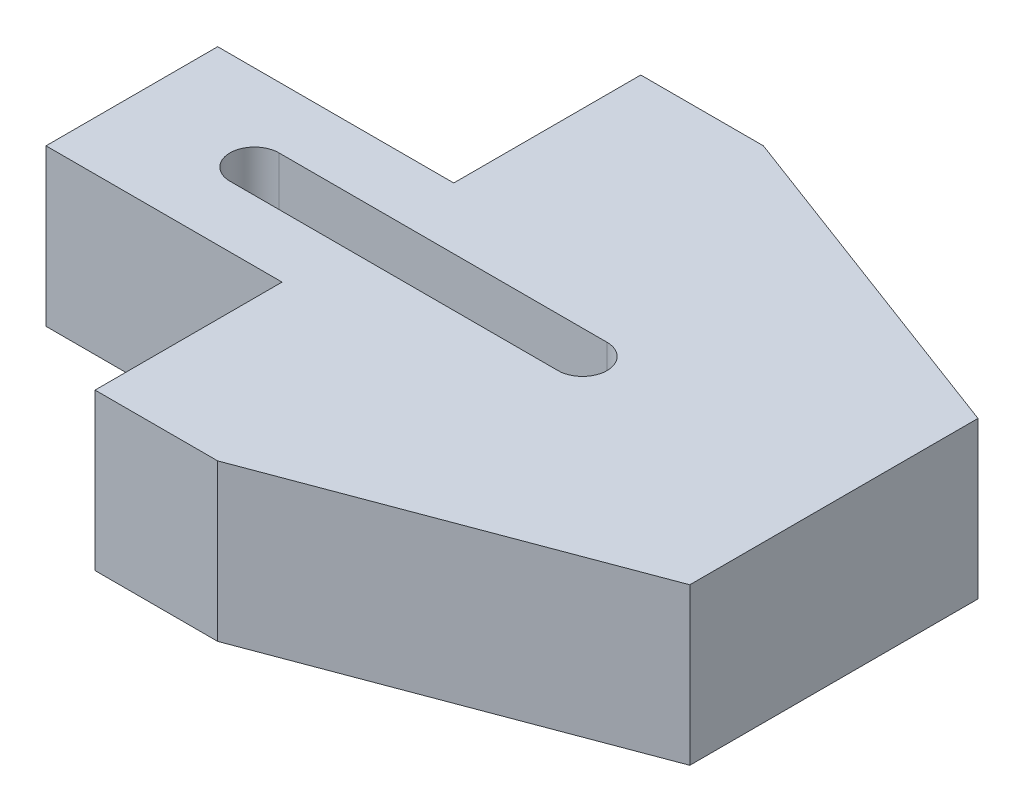
ISO-10303-21;
HEADER;
FILE_DESCRIPTION(('STEP AP214'),'2;1');
FILE_NAME('part.step','',(''),(''),'','','');
FILE_SCHEMA(('AUTOMOTIVE_DESIGN { 1 0 10303 214 1 1 1 1 }'));
ENDSEC;
DATA;
#1=APPLICATION_CONTEXT('core data for automotive mechanical design processes');
#2=APPLICATION_PROTOCOL_DEFINITION('international standard','automotive_design',2000,#1);
#3=PRODUCT_CONTEXT('',#1,'mechanical');
#4=PRODUCT('Part','Part','',(#3));
#5=PRODUCT_RELATED_PRODUCT_CATEGORY('part','',(#4));
#6=PRODUCT_DEFINITION_FORMATION('','',#4);
#7=PRODUCT_DEFINITION_CONTEXT('part definition',#1,'design');
#8=PRODUCT_DEFINITION('design','',#6,#7);
#9=PRODUCT_DEFINITION_SHAPE('','',#8);
#10=(LENGTH_UNIT() NAMED_UNIT(*) SI_UNIT(.MILLI.,.METRE.));
#11=(NAMED_UNIT(*) PLANE_ANGLE_UNIT() SI_UNIT($,.RADIAN.));
#12=(NAMED_UNIT(*) SI_UNIT($,.STERADIAN.) SOLID_ANGLE_UNIT());
#13=UNCERTAINTY_MEASURE_WITH_UNIT(LENGTH_MEASURE(1.E-05),#10,'distance_accuracy_value','');
#14=(GEOMETRIC_REPRESENTATION_CONTEXT(3) GLOBAL_UNCERTAINTY_ASSIGNED_CONTEXT((#13)) GLOBAL_UNIT_ASSIGNED_CONTEXT((#10,
#11,#12)) REPRESENTATION_CONTEXT('',''));
#15=CARTESIAN_POINT('',(0.,0.,0.));
#16=DIRECTION('',(0.,0.,1.));
#17=DIRECTION('',(1.,0.,0.));
#18=AXIS2_PLACEMENT_3D('',#15,#16,#17);
#19=CARTESIAN_POINT('',(0.,2.55,-4.7));
#20=DIRECTION('',(-1.,0.,0.));
#21=DIRECTION('',(0.,0.,1.));
#22=AXIS2_PLACEMENT_3D('',#19,#20,#21);
#23=PLANE('',#22);
#24=DIRECTION('',(0.,0.,-1.));
#25=VECTOR('',#24,1.);
#26=CARTESIAN_POINT('',(0.,-2.55,-4.7));
#27=LINE('',#26,#25);
#28=CARTESIAN_POINT('',(0.,-2.55,4.7));
#29=VERTEX_POINT('',#28);
#30=CARTESIAN_POINT('',(0.,-2.55,-4.7));
#31=VERTEX_POINT('',#30);
#32=EDGE_CURVE('E204',#29,#31,#27,.T.);
#33=ORIENTED_EDGE('',*,*,#32,.T.);
#34=DIRECTION('',(0.,-1.,0.));
#35=VECTOR('',#34,1.);
#36=CARTESIAN_POINT('',(0.,2.55,-4.7));
#37=LINE('',#36,#35);
#38=CARTESIAN_POINT('',(0.,2.55,-4.7));
#39=VERTEX_POINT('',#38);
#40=EDGE_CURVE('E11',#39,#31,#37,.T.);
#41=ORIENTED_EDGE('',*,*,#40,.F.);
#42=DIRECTION('',(0.,0.,-1.));
#43=VECTOR('',#42,1.);
#44=CARTESIAN_POINT('',(0.,2.55,-4.7));
#45=LINE('',#44,#43);
#46=CARTESIAN_POINT('',(0.,2.55,4.7));
#47=VERTEX_POINT('',#46);
#48=EDGE_CURVE('E205',#47,#39,#45,.T.);
#49=ORIENTED_EDGE('',*,*,#48,.F.);
#50=DIRECTION('',(0.,-1.,0.));
#51=VECTOR('',#50,1.);
#52=CARTESIAN_POINT('',(0.,2.55,4.7));
#53=LINE('',#52,#51);
#54=EDGE_CURVE('E182',#47,#29,#53,.T.);
#55=ORIENTED_EDGE('',*,*,#54,.T.);
#56=EDGE_LOOP('',(#33,#41,#49,#55));
#57=FACE_BOUND('',#56,.T.);
#58=ADVANCED_FACE('F32',(#57),#23,.F.);
#59=CARTESIAN_POINT('',(-11.2,2.55,-8.9));
#60=DIRECTION('',(-0.351123441588392,0.,0.936329177569045));
#61=DIRECTION('',(0.936329177569045,0.,0.351123441588392));
#62=AXIS2_PLACEMENT_3D('',#59,#60,#61);
#63=PLANE('',#62);
#64=DIRECTION('',(-0.936329177569045,0.,-0.351123441588392));
#65=VECTOR('',#64,1.);
#66=CARTESIAN_POINT('',(-11.2,-2.55,-8.9));
#67=LINE('',#66,#65);
#68=CARTESIAN_POINT('',(-11.2,-2.55,-8.9));
#69=VERTEX_POINT('',#68);
#70=EDGE_CURVE('E220',#31,#69,#67,.T.);
#71=ORIENTED_EDGE('',*,*,#70,.T.);
#72=DIRECTION('',(0.,-1.,0.));
#73=VECTOR('',#72,1.);
#74=CARTESIAN_POINT('',(-11.2,2.55,-8.9));
#75=LINE('',#74,#73);
#76=CARTESIAN_POINT('',(-11.2,2.55,-8.9));
#77=VERTEX_POINT('',#76);
#78=EDGE_CURVE('E39',#77,#69,#75,.T.);
#79=ORIENTED_EDGE('',*,*,#78,.F.);
#80=DIRECTION('',(-0.936329177569045,0.,-0.351123441588392));
#81=VECTOR('',#80,1.);
#82=CARTESIAN_POINT('',(-11.2,2.55,-8.9));
#83=LINE('',#82,#81);
#84=EDGE_CURVE('E207',#39,#77,#83,.T.);
#85=ORIENTED_EDGE('',*,*,#84,.F.);
#86=ORIENTED_EDGE('',*,*,#40,.T.);
#87=EDGE_LOOP('',(#71,#79,#85,#86));
#88=FACE_BOUND('',#87,.T.);
#89=ADVANCED_FACE('F264',(#88),#63,.F.);
#90=CARTESIAN_POINT('',(-15.2,2.55,-8.9));
#91=DIRECTION('',(0.,0.,1.));
#92=DIRECTION('',(1.,0.,0.));
#93=AXIS2_PLACEMENT_3D('',#90,#91,#92);
#94=PLANE('',#93);
#95=DIRECTION('',(-1.,0.,0.));
#96=VECTOR('',#95,1.);
#97=CARTESIAN_POINT('',(-15.2,-2.55,-8.9));
#98=LINE('',#97,#96);
#99=CARTESIAN_POINT('',(-15.2,-2.55,-8.9));
#100=VERTEX_POINT('',#99);
#101=EDGE_CURVE('E222',#69,#100,#98,.T.);
#102=ORIENTED_EDGE('',*,*,#101,.T.);
#103=DIRECTION('',(0.,-1.,0.));
#104=VECTOR('',#103,1.);
#105=CARTESIAN_POINT('',(-15.2,2.55,-8.9));
#106=LINE('',#105,#104);
#107=CARTESIAN_POINT('',(-15.2,2.55,-8.9));
#108=VERTEX_POINT('',#107);
#109=EDGE_CURVE('E234',#108,#100,#106,.T.);
#110=ORIENTED_EDGE('',*,*,#109,.F.);
#111=DIRECTION('',(-1.,0.,0.));
#112=VECTOR('',#111,1.);
#113=CARTESIAN_POINT('',(-15.2,2.55,-8.9));
#114=LINE('',#113,#112);
#115=EDGE_CURVE('E210',#77,#108,#114,.T.);
#116=ORIENTED_EDGE('',*,*,#115,.F.);
#117=ORIENTED_EDGE('',*,*,#78,.T.);
#118=EDGE_LOOP('',(#102,#110,#116,#117));
#119=FACE_BOUND('',#118,.T.);
#120=ADVANCED_FACE('F241',(#119),#94,.F.);
#121=CARTESIAN_POINT('',(-15.2,2.55,-2.8));
#122=DIRECTION('',(1.,0.,0.));
#123=DIRECTION('',(0.,0.,-1.));
#124=AXIS2_PLACEMENT_3D('',#121,#122,#123);
#125=PLANE('',#124);
#126=DIRECTION('',(0.,0.,1.));
#127=VECTOR('',#126,1.);
#128=CARTESIAN_POINT('',(-15.2,-2.55,-2.8));
#129=LINE('',#128,#127);
#130=CARTESIAN_POINT('',(-15.2,-2.55,-2.8));
#131=VERTEX_POINT('',#130);
#132=EDGE_CURVE('E224',#100,#131,#129,.T.);
#133=ORIENTED_EDGE('',*,*,#132,.T.);
#134=DIRECTION('',(0.,-1.,0.));
#135=VECTOR('',#134,1.);
#136=CARTESIAN_POINT('',(-15.2,2.55,-2.8));
#137=LINE('',#136,#135);
#138=CARTESIAN_POINT('',(-15.2,2.55,-2.8));
#139=VERTEX_POINT('',#138);
#140=EDGE_CURVE('E231',#139,#131,#137,.T.);
#141=ORIENTED_EDGE('',*,*,#140,.F.);
#142=DIRECTION('',(0.,0.,1.));
#143=VECTOR('',#142,1.);
#144=CARTESIAN_POINT('',(-15.2,2.55,-2.8));
#145=LINE('',#144,#143);
#146=EDGE_CURVE('E212',#108,#139,#145,.T.);
#147=ORIENTED_EDGE('',*,*,#146,.F.);
#148=ORIENTED_EDGE('',*,*,#109,.T.);
#149=EDGE_LOOP('',(#133,#141,#147,#148));
#150=FACE_BOUND('',#149,.T.);
#151=ADVANCED_FACE('F251',(#150),#125,.F.);
#152=CARTESIAN_POINT('',(-22.9,2.55,-2.8));
#153=DIRECTION('',(0.,0.,1.));
#154=DIRECTION('',(1.,0.,0.));
#155=AXIS2_PLACEMENT_3D('',#152,#153,#154);
#156=PLANE('',#155);
#157=DIRECTION('',(-1.,0.,0.));
#158=VECTOR('',#157,1.);
#159=CARTESIAN_POINT('',(-22.9,-2.55,-2.8));
#160=LINE('',#159,#158);
#161=CARTESIAN_POINT('',(-22.9,-2.55,-2.8));
#162=VERTEX_POINT('',#161);
#163=EDGE_CURVE('E226',#131,#162,#160,.T.);
#164=ORIENTED_EDGE('',*,*,#163,.T.);
#165=DIRECTION('',(0.,-1.,0.));
#166=VECTOR('',#165,1.);
#167=CARTESIAN_POINT('',(-22.9,2.55,-2.8));
#168=LINE('',#167,#166);
#169=CARTESIAN_POINT('',(-22.9,2.55,-2.8));
#170=VERTEX_POINT('',#169);
#171=EDGE_CURVE('E218',#170,#162,#168,.T.);
#172=ORIENTED_EDGE('',*,*,#171,.F.);
#173=DIRECTION('',(-1.,0.,0.));
#174=VECTOR('',#173,1.);
#175=CARTESIAN_POINT('',(-22.9,2.55,-2.8));
#176=LINE('',#175,#174);
#177=EDGE_CURVE('E214',#139,#170,#176,.T.);
#178=ORIENTED_EDGE('',*,*,#177,.F.);
#179=ORIENTED_EDGE('',*,*,#140,.T.);
#180=EDGE_LOOP('',(#164,#172,#178,#179));
#181=FACE_BOUND('',#180,.T.);
#182=ADVANCED_FACE('F255',(#181),#156,.F.);
#183=CARTESIAN_POINT('',(-22.9,2.55,0.));
#184=DIRECTION('',(1.,0.,0.));
#185=DIRECTION('',(0.,0.,-1.));
#186=AXIS2_PLACEMENT_3D('',#183,#184,#185);
#187=PLANE('',#186);
#188=DIRECTION('',(0.,0.,1.));
#189=VECTOR('',#188,1.);
#190=CARTESIAN_POINT('',(-22.9,-2.55,0.));
#191=LINE('',#190,#189);
#192=CARTESIAN_POINT('',(-22.9,-2.55,2.8));
#193=VERTEX_POINT('',#192);
#194=EDGE_CURVE('E208',#162,#193,#191,.T.);
#195=ORIENTED_EDGE('',*,*,#194,.T.);
#196=DIRECTION('',(0.,-1.,0.));
#197=VECTOR('',#196,1.);
#198=CARTESIAN_POINT('',(-22.9,2.55,2.8));
#199=LINE('',#198,#197);
#200=CARTESIAN_POINT('',(-22.9,2.55,2.8));
#201=VERTEX_POINT('',#200);
#202=EDGE_CURVE('E201',#201,#193,#199,.T.);
#203=ORIENTED_EDGE('',*,*,#202,.F.);
#204=DIRECTION('',(0.,0.,1.));
#205=VECTOR('',#204,1.);
#206=CARTESIAN_POINT('',(-22.9,2.55,0.));
#207=LINE('',#206,#205);
#208=EDGE_CURVE('E216',#170,#201,#207,.T.);
#209=ORIENTED_EDGE('',*,*,#208,.F.);
#210=ORIENTED_EDGE('',*,*,#171,.T.);
#211=EDGE_LOOP('',(#195,#203,#209,#210));
#212=FACE_BOUND('',#211,.T.);
#213=ADVANCED_FACE('F282',(#212),#187,.F.);
#214=CARTESIAN_POINT('',(0.,2.55,0.));
#215=DIRECTION('',(0.,-1.,0.));
#216=DIRECTION('',(0.,0.,-1.));
#217=AXIS2_PLACEMENT_3D('',#214,#215,#216);
#218=PLANE('',#217);
#219=DIRECTION('',(1.,0.,0.));
#220=VECTOR('',#219,1.);
#221=CARTESIAN_POINT('',(-18.9,2.55,0.8));
#222=LINE('',#221,#220);
#223=CARTESIAN_POINT('',(-18.9,2.55,0.8));
#224=VERTEX_POINT('',#223);
#225=CARTESIAN_POINT('',(-8.2,2.55,0.8));
#226=VERTEX_POINT('',#225);
#227=EDGE_CURVE('E159',#224,#226,#222,.T.);
#228=ORIENTED_EDGE('',*,*,#227,.F.);
#229=CARTESIAN_POINT('',(-18.9,2.55,0.));
#230=DIRECTION('',(0.,1.,0.));
#231=DIRECTION('',(0.,0.,1.));
#232=AXIS2_PLACEMENT_3D('',#229,#230,#231);
#233=CIRCLE('',#232,0.8);
#234=CARTESIAN_POINT('',(-18.9,2.55,-0.8));
#235=VERTEX_POINT('',#234);
#236=EDGE_CURVE('E46',#235,#224,#233,.T.);
#237=ORIENTED_EDGE('',*,*,#236,.F.);
#238=DIRECTION('',(-1.,0.,0.));
#239=VECTOR('',#238,1.);
#240=CARTESIAN_POINT('',(-18.9,2.55,-0.8));
#241=LINE('',#240,#239);
#242=CARTESIAN_POINT('',(-8.2,2.55,-0.8));
#243=VERTEX_POINT('',#242);
#244=EDGE_CURVE('E150',#243,#235,#241,.T.);
#245=ORIENTED_EDGE('',*,*,#244,.F.);
#246=CARTESIAN_POINT('',(-8.2,2.55,0.));
#247=DIRECTION('',(0.,1.,0.));
#248=DIRECTION('',(0.,0.,1.));
#249=AXIS2_PLACEMENT_3D('',#246,#247,#248);
#250=CIRCLE('',#249,0.8);
#251=EDGE_CURVE('E153',#226,#243,#250,.T.);
#252=ORIENTED_EDGE('',*,*,#251,.F.);
#253=EDGE_LOOP('',(#228,#237,#245,#252));
#254=FACE_BOUND('',#253,.T.);
#255=ORIENTED_EDGE('',*,*,#208,.T.);
#256=DIRECTION('',(-1.,0.,0.));
#257=VECTOR('',#256,1.);
#258=CARTESIAN_POINT('',(-22.9,2.55,2.8));
#259=LINE('',#258,#257);
#260=CARTESIAN_POINT('',(-15.2,2.55,2.8));
#261=VERTEX_POINT('',#260);
#262=EDGE_CURVE('E169',#261,#201,#259,.T.);
#263=ORIENTED_EDGE('',*,*,#262,.F.);
#264=DIRECTION('',(0.,0.,-1.));
#265=VECTOR('',#264,1.);
#266=CARTESIAN_POINT('',(-15.2,2.55,2.8));
#267=LINE('',#266,#265);
#268=CARTESIAN_POINT('',(-15.2,2.55,8.9));
#269=VERTEX_POINT('',#268);
#270=EDGE_CURVE('E172',#269,#261,#267,.T.);
#271=ORIENTED_EDGE('',*,*,#270,.F.);
#272=DIRECTION('',(-1.,0.,0.));
#273=VECTOR('',#272,1.);
#274=CARTESIAN_POINT('',(-15.2,2.55,8.9));
#275=LINE('',#274,#273);
#276=CARTESIAN_POINT('',(-11.2,2.55,8.9));
#277=VERTEX_POINT('',#276);
#278=EDGE_CURVE('E176',#277,#269,#275,.T.);
#279=ORIENTED_EDGE('',*,*,#278,.F.);
#280=DIRECTION('',(-0.936329177569045,0.,0.351123441588392));
#281=VECTOR('',#280,1.);
#282=CARTESIAN_POINT('',(-11.2,2.55,8.9));
#283=LINE('',#282,#281);
#284=EDGE_CURVE('E179',#47,#277,#283,.T.);
#285=ORIENTED_EDGE('',*,*,#284,.F.);
#286=ORIENTED_EDGE('',*,*,#48,.T.);
#287=ORIENTED_EDGE('',*,*,#84,.T.);
#288=ORIENTED_EDGE('',*,*,#115,.T.);
#289=ORIENTED_EDGE('',*,*,#146,.T.);
#290=ORIENTED_EDGE('',*,*,#177,.T.);
#291=EDGE_LOOP('',(#255,#263,#271,#279,#285,#286,#287,#288,#289,#290));
#292=FACE_BOUND('',#291,.T.);
#293=ADVANCED_FACE('F259',(#254,#292),#218,.F.);
#294=CARTESIAN_POINT('',(0.,-2.55,0.));
#295=DIRECTION('',(0.,-1.,0.));
#296=DIRECTION('',(0.,0.,-1.));
#297=AXIS2_PLACEMENT_3D('',#294,#295,#296);
#298=PLANE('',#297);
#299=CARTESIAN_POINT('',(-18.9,-2.55,0.));
#300=DIRECTION('',(0.,1.,0.));
#301=DIRECTION('',(0.,0.,1.));
#302=AXIS2_PLACEMENT_3D('',#299,#300,#301);
#303=CIRCLE('',#302,0.8);
#304=CARTESIAN_POINT('',(-18.9,-2.55,-0.8));
#305=VERTEX_POINT('',#304);
#306=CARTESIAN_POINT('',(-18.9,-2.55,0.8));
#307=VERTEX_POINT('',#306);
#308=EDGE_CURVE('E134',#305,#307,#303,.T.);
#309=ORIENTED_EDGE('',*,*,#308,.T.);
#310=DIRECTION('',(1.,0.,0.));
#311=VECTOR('',#310,1.);
#312=CARTESIAN_POINT('',(-18.9,-2.55,0.8));
#313=LINE('',#312,#311);
#314=CARTESIAN_POINT('',(-8.2,-2.55,0.8));
#315=VERTEX_POINT('',#314);
#316=EDGE_CURVE('E143',#307,#315,#313,.T.);
#317=ORIENTED_EDGE('',*,*,#316,.T.);
#318=CARTESIAN_POINT('',(-8.2,-2.55,0.));
#319=DIRECTION('',(0.,1.,0.));
#320=DIRECTION('',(0.,0.,1.));
#321=AXIS2_PLACEMENT_3D('',#318,#319,#320);
#322=CIRCLE('',#321,0.8);
#323=CARTESIAN_POINT('',(-8.2,-2.55,-0.8));
#324=VERTEX_POINT('',#323);
#325=EDGE_CURVE('E54',#315,#324,#322,.T.);
#326=ORIENTED_EDGE('',*,*,#325,.T.);
#327=DIRECTION('',(-1.,0.,0.));
#328=VECTOR('',#327,1.);
#329=CARTESIAN_POINT('',(-18.9,-2.55,-0.8));
#330=LINE('',#329,#328);
#331=EDGE_CURVE('E140',#324,#305,#330,.T.);
#332=ORIENTED_EDGE('',*,*,#331,.T.);
#333=EDGE_LOOP('',(#309,#317,#326,#332));
#334=FACE_BOUND('',#333,.T.);
#335=ORIENTED_EDGE('',*,*,#32,.F.);
#336=DIRECTION('',(-0.936329177569045,0.,0.351123441588392));
#337=VECTOR('',#336,1.);
#338=CARTESIAN_POINT('',(-11.2,-2.55,8.9));
#339=LINE('',#338,#337);
#340=CARTESIAN_POINT('',(-11.2,-2.55,8.9));
#341=VERTEX_POINT('',#340);
#342=EDGE_CURVE('E173',#29,#341,#339,.T.);
#343=ORIENTED_EDGE('',*,*,#342,.T.);
#344=DIRECTION('',(-1.,0.,0.));
#345=VECTOR('',#344,1.);
#346=CARTESIAN_POINT('',(-15.2,-2.55,8.9));
#347=LINE('',#346,#345);
#348=CARTESIAN_POINT('',(-15.2,-2.55,8.9));
#349=VERTEX_POINT('',#348);
#350=EDGE_CURVE('E188',#341,#349,#347,.T.);
#351=ORIENTED_EDGE('',*,*,#350,.T.);
#352=DIRECTION('',(0.,0.,-1.));
#353=VECTOR('',#352,1.);
#354=CARTESIAN_POINT('',(-15.2,-2.55,2.8));
#355=LINE('',#354,#353);
#356=CARTESIAN_POINT('',(-15.2,-2.55,2.8));
#357=VERTEX_POINT('',#356);
#358=EDGE_CURVE('E185',#349,#357,#355,.T.);
#359=ORIENTED_EDGE('',*,*,#358,.T.);
#360=DIRECTION('',(-1.,0.,0.));
#361=VECTOR('',#360,1.);
#362=CARTESIAN_POINT('',(-22.9,-2.55,2.8));
#363=LINE('',#362,#361);
#364=EDGE_CURVE('E165',#357,#193,#363,.T.);
#365=ORIENTED_EDGE('',*,*,#364,.T.);
#366=ORIENTED_EDGE('',*,*,#194,.F.);
#367=ORIENTED_EDGE('',*,*,#163,.F.);
#368=ORIENTED_EDGE('',*,*,#132,.F.);
#369=ORIENTED_EDGE('',*,*,#101,.F.);
#370=ORIENTED_EDGE('',*,*,#70,.F.);
#371=EDGE_LOOP('',(#335,#343,#351,#359,#365,#366,#367,#368,#369,#370));
#372=FACE_BOUND('',#371,.T.);
#373=ADVANCED_FACE('F147',(#334,#372),#298,.T.);
#374=CARTESIAN_POINT('',(-22.9,2.55,2.8));
#375=DIRECTION('',(0.,0.,1.));
#376=DIRECTION('',(1.,0.,0.));
#377=AXIS2_PLACEMENT_3D('',#374,#375,#376);
#378=PLANE('',#377);
#379=ORIENTED_EDGE('',*,*,#364,.F.);
#380=DIRECTION('',(0.,-1.,0.));
#381=VECTOR('',#380,1.);
#382=CARTESIAN_POINT('',(-15.2,2.55,2.8));
#383=LINE('',#382,#381);
#384=EDGE_CURVE('E199',#261,#357,#383,.T.);
#385=ORIENTED_EDGE('',*,*,#384,.F.);
#386=ORIENTED_EDGE('',*,*,#262,.T.);
#387=ORIENTED_EDGE('',*,*,#202,.T.);
#388=EDGE_LOOP('',(#379,#385,#386,#387));
#389=FACE_BOUND('',#388,.T.);
#390=ADVANCED_FACE('F280',(#389),#378,.T.);
#391=CARTESIAN_POINT('',(-15.2,2.55,2.8));
#392=DIRECTION('',(-1.,0.,0.));
#393=DIRECTION('',(0.,0.,1.));
#394=AXIS2_PLACEMENT_3D('',#391,#392,#393);
#395=PLANE('',#394);
#396=ORIENTED_EDGE('',*,*,#358,.F.);
#397=DIRECTION('',(0.,-1.,0.));
#398=VECTOR('',#397,1.);
#399=CARTESIAN_POINT('',(-15.2,2.55,8.9));
#400=LINE('',#399,#398);
#401=EDGE_CURVE('E197',#269,#349,#400,.T.);
#402=ORIENTED_EDGE('',*,*,#401,.F.);
#403=ORIENTED_EDGE('',*,*,#270,.T.);
#404=ORIENTED_EDGE('',*,*,#384,.T.);
#405=EDGE_LOOP('',(#396,#402,#403,#404));
#406=FACE_BOUND('',#405,.T.);
#407=ADVANCED_FACE('F277',(#406),#395,.T.);
#408=CARTESIAN_POINT('',(-15.2,2.55,8.9));
#409=DIRECTION('',(0.,0.,1.));
#410=DIRECTION('',(1.,0.,0.));
#411=AXIS2_PLACEMENT_3D('',#408,#409,#410);
#412=PLANE('',#411);
#413=ORIENTED_EDGE('',*,*,#350,.F.);
#414=DIRECTION('',(0.,-1.,0.));
#415=VECTOR('',#414,1.);
#416=CARTESIAN_POINT('',(-11.2,2.55,8.9));
#417=LINE('',#416,#415);
#418=EDGE_CURVE('E195',#277,#341,#417,.T.);
#419=ORIENTED_EDGE('',*,*,#418,.F.);
#420=ORIENTED_EDGE('',*,*,#278,.T.);
#421=ORIENTED_EDGE('',*,*,#401,.T.);
#422=EDGE_LOOP('',(#413,#419,#420,#421));
#423=FACE_BOUND('',#422,.T.);
#424=ADVANCED_FACE('F273',(#423),#412,.T.);
#425=CARTESIAN_POINT('',(-11.2,2.55,8.9));
#426=DIRECTION('',(0.351123441588392,0.,0.936329177569045));
#427=DIRECTION('',(0.936329177569045,0.,-0.351123441588392));
#428=AXIS2_PLACEMENT_3D('',#425,#426,#427);
#429=PLANE('',#428);
#430=ORIENTED_EDGE('',*,*,#342,.F.);
#431=ORIENTED_EDGE('',*,*,#54,.F.);
#432=ORIENTED_EDGE('',*,*,#284,.T.);
#433=ORIENTED_EDGE('',*,*,#418,.T.);
#434=EDGE_LOOP('',(#430,#431,#432,#433));
#435=FACE_BOUND('',#434,.T.);
#436=ADVANCED_FACE('F270',(#435),#429,.T.);
#437=CARTESIAN_POINT('',(-18.9,-2.55,0.));
#438=DIRECTION('',(0.,1.,0.));
#439=DIRECTION('',(0.,0.,1.));
#440=AXIS2_PLACEMENT_3D('',#437,#438,#439);
#441=CYLINDRICAL_SURFACE('',#440,0.8);
#442=ORIENTED_EDGE('',*,*,#236,.T.);
#443=DIRECTION('',(0.,1.,0.));
#444=VECTOR('',#443,1.);
#445=CARTESIAN_POINT('',(-18.9,-2.55,0.8));
#446=LINE('',#445,#444);
#447=EDGE_CURVE('E130',#307,#224,#446,.T.);
#448=ORIENTED_EDGE('',*,*,#447,.F.);
#449=ORIENTED_EDGE('',*,*,#308,.F.);
#450=DIRECTION('',(0.,1.,0.));
#451=VECTOR('',#450,1.);
#452=CARTESIAN_POINT('',(-18.9,-2.55,-0.8));
#453=LINE('',#452,#451);
#454=EDGE_CURVE('E163',#305,#235,#453,.T.);
#455=ORIENTED_EDGE('',*,*,#454,.T.);
#456=EDGE_LOOP('',(#442,#448,#449,#455));
#457=FACE_BOUND('',#456,.T.);
#458=ADVANCED_FACE('F132',(#457),#441,.F.);
#459=CARTESIAN_POINT('',(-18.9,-2.55,-0.8));
#460=DIRECTION('',(0.,0.,-1.));
#461=DIRECTION('',(-1.,0.,0.));
#462=AXIS2_PLACEMENT_3D('',#459,#460,#461);
#463=PLANE('',#462);
#464=ORIENTED_EDGE('',*,*,#244,.T.);
#465=ORIENTED_EDGE('',*,*,#454,.F.);
#466=ORIENTED_EDGE('',*,*,#331,.F.);
#467=DIRECTION('',(0.,1.,0.));
#468=VECTOR('',#467,1.);
#469=CARTESIAN_POINT('',(-8.2,-2.55,-0.8));
#470=LINE('',#469,#468);
#471=EDGE_CURVE('E166',#324,#243,#470,.T.);
#472=ORIENTED_EDGE('',*,*,#471,.T.);
#473=EDGE_LOOP('',(#464,#465,#466,#472));
#474=FACE_BOUND('',#473,.T.);
#475=ADVANCED_FACE('F377',(#474),#463,.F.);
#476=CARTESIAN_POINT('',(-8.2,-2.55,0.));
#477=DIRECTION('',(0.,1.,0.));
#478=DIRECTION('',(0.,0.,1.));
#479=AXIS2_PLACEMENT_3D('',#476,#477,#478);
#480=CYLINDRICAL_SURFACE('',#479,0.8);
#481=ORIENTED_EDGE('',*,*,#251,.T.);
#482=ORIENTED_EDGE('',*,*,#471,.F.);
#483=ORIENTED_EDGE('',*,*,#325,.F.);
#484=DIRECTION('',(0.,1.,0.));
#485=VECTOR('',#484,1.);
#486=CARTESIAN_POINT('',(-8.2,-2.55,0.8));
#487=LINE('',#486,#485);
#488=EDGE_CURVE('E139',#315,#226,#487,.T.);
#489=ORIENTED_EDGE('',*,*,#488,.T.);
#490=EDGE_LOOP('',(#481,#482,#483,#489));
#491=FACE_BOUND('',#490,.T.);
#492=ADVANCED_FACE('F386',(#491),#480,.F.);
#493=CARTESIAN_POINT('',(-18.9,-2.55,0.8));
#494=DIRECTION('',(0.,0.,1.));
#495=DIRECTION('',(1.,0.,0.));
#496=AXIS2_PLACEMENT_3D('',#493,#494,#495);
#497=PLANE('',#496);
#498=ORIENTED_EDGE('',*,*,#227,.T.);
#499=ORIENTED_EDGE('',*,*,#488,.F.);
#500=ORIENTED_EDGE('',*,*,#316,.F.);
#501=ORIENTED_EDGE('',*,*,#447,.T.);
#502=EDGE_LOOP('',(#498,#499,#500,#501));
#503=FACE_BOUND('',#502,.T.);
#504=ADVANCED_FACE('F144',(#503),#497,.F.);
#505=CLOSED_SHELL('',(#58,#89,#120,#151,#182,#213,#293,#373,#390,#407,#424,#436,#458,#475,#492,#504));
#506=MANIFOLD_SOLID_BREP('B2',#505);
#507=ADVANCED_BREP_SHAPE_REPRESENTATION('',(#18,#506),#14);
#508=SHAPE_DEFINITION_REPRESENTATION(#9,#507);
ENDSEC;
END-ISO-10303-21;
